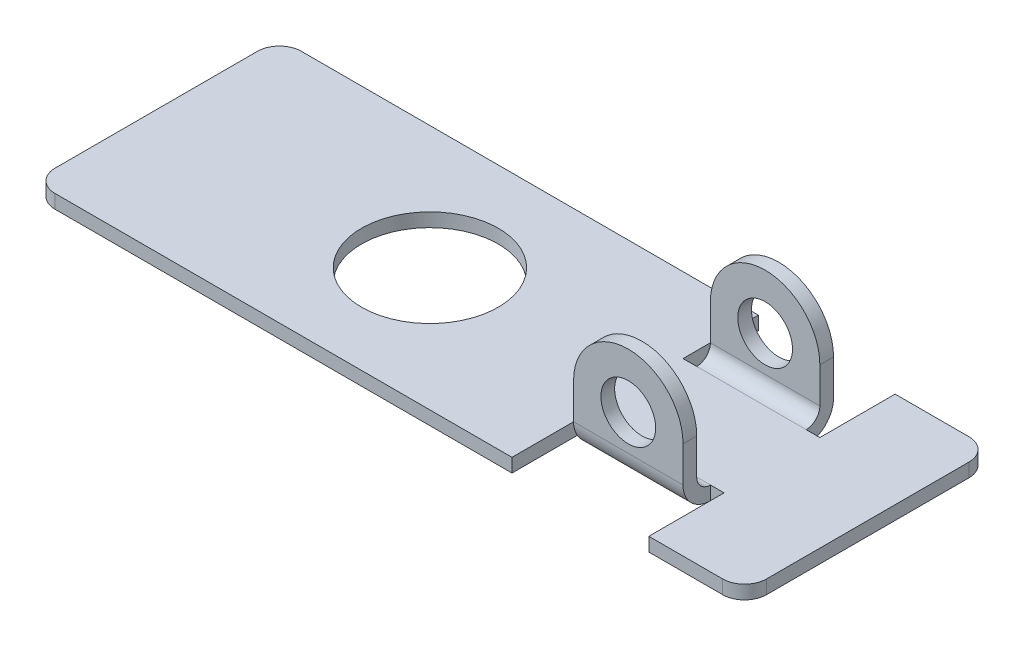
ISO-10303-21;
HEADER;
FILE_DESCRIPTION(('STEP AP214'),'2;1');
FILE_NAME('part.step','',(''),(''),'','','');
FILE_SCHEMA(('AUTOMOTIVE_DESIGN { 1 0 10303 214 1 1 1 1 }'));
ENDSEC;
DATA;
#1=APPLICATION_CONTEXT('core data for automotive mechanical design processes');
#2=APPLICATION_PROTOCOL_DEFINITION('international standard','automotive_design',2000,#1);
#3=PRODUCT_CONTEXT('',#1,'mechanical');
#4=PRODUCT('Part','Part','',(#3));
#5=PRODUCT_RELATED_PRODUCT_CATEGORY('part','',(#4));
#6=PRODUCT_DEFINITION_FORMATION('','',#4);
#7=PRODUCT_DEFINITION_CONTEXT('part definition',#1,'design');
#8=PRODUCT_DEFINITION('design','',#6,#7);
#9=PRODUCT_DEFINITION_SHAPE('','',#8);
#10=(LENGTH_UNIT() NAMED_UNIT(*) SI_UNIT(.MILLI.,.METRE.));
#11=(NAMED_UNIT(*) PLANE_ANGLE_UNIT() SI_UNIT($,.RADIAN.));
#12=(NAMED_UNIT(*) SI_UNIT($,.STERADIAN.) SOLID_ANGLE_UNIT());
#13=UNCERTAINTY_MEASURE_WITH_UNIT(LENGTH_MEASURE(1.E-05),#10,'distance_accuracy_value','');
#14=(GEOMETRIC_REPRESENTATION_CONTEXT(3) GLOBAL_UNCERTAINTY_ASSIGNED_CONTEXT((#13)) GLOBAL_UNIT_ASSIGNED_CONTEXT((#10,
#11,#12)) REPRESENTATION_CONTEXT('',''));
#15=CARTESIAN_POINT('',(0.,0.,0.));
#16=DIRECTION('',(0.,0.,1.));
#17=DIRECTION('',(1.,0.,0.));
#18=AXIS2_PLACEMENT_3D('',#15,#16,#17);
#19=CARTESIAN_POINT('',(0.,0.5,0.));
#20=DIRECTION('',(0.,-1.,0.));
#21=DIRECTION('',(0.,0.,-1.));
#22=AXIS2_PLACEMENT_3D('',#19,#20,#21);
#23=PLANE('',#22);
#24=DIRECTION('',(1.,0.,0.));
#25=VECTOR('',#24,1.);
#26=CARTESIAN_POINT('',(7.5,0.5,1.75));
#27=LINE('',#26,#25);
#28=CARTESIAN_POINT('',(7.5,0.5,1.75));
#29=VERTEX_POINT('',#28);
#30=CARTESIAN_POINT('',(8.,0.5,1.75));
#31=VERTEX_POINT('',#30);
#32=EDGE_CURVE('E308',#29,#31,#27,.T.);
#33=ORIENTED_EDGE('',*,*,#32,.T.);
#34=DIRECTION('',(1.,0.,0.));
#35=VECTOR('',#34,1.);
#36=CARTESIAN_POINT('',(0.,0.5,1.75));
#37=LINE('',#36,#35);
#38=CARTESIAN_POINT('',(12.,0.5,1.75));
#39=VERTEX_POINT('',#38);
#40=EDGE_CURVE('E430',#31,#39,#37,.T.);
#41=ORIENTED_EDGE('',*,*,#40,.T.);
#42=DIRECTION('',(1.,0.,0.));
#43=VECTOR('',#42,1.);
#44=CARTESIAN_POINT('',(12.5,0.5,1.75));
#45=LINE('',#44,#43);
#46=CARTESIAN_POINT('',(12.5,0.5,1.75));
#47=VERTEX_POINT('',#46);
#48=EDGE_CURVE('E311',#39,#47,#45,.T.);
#49=ORIENTED_EDGE('',*,*,#48,.T.);
#50=DIRECTION('',(0.,0.,1.));
#51=VECTOR('',#50,1.);
#52=CARTESIAN_POINT('',(12.5,0.5,4.5));
#53=LINE('',#52,#51);
#54=CARTESIAN_POINT('',(12.5,0.5,4.5));
#55=VERTEX_POINT('',#54);
#56=EDGE_CURVE('E313',#47,#55,#53,.T.);
#57=ORIENTED_EDGE('',*,*,#56,.T.);
#58=DIRECTION('',(1.,0.,0.));
#59=VECTOR('',#58,1.);
#60=CARTESIAN_POINT('',(12.5,0.5,4.5));
#61=LINE('',#60,#59);
#62=CARTESIAN_POINT('',(15.2,0.5,4.5));
#63=VERTEX_POINT('',#62);
#64=EDGE_CURVE('E280',#55,#63,#61,.T.);
#65=ORIENTED_EDGE('',*,*,#64,.T.);
#66=CARTESIAN_POINT('',(15.2,0.5,3.7));
#67=DIRECTION('',(0.,-1.,0.));
#68=DIRECTION('',(0.,0.,-1.));
#69=AXIS2_PLACEMENT_3D('',#66,#67,#68);
#70=CIRCLE('',#69,0.8);
#71=CARTESIAN_POINT('',(16.,0.5,3.7));
#72=VERTEX_POINT('',#71);
#73=EDGE_CURVE('E412',#63,#72,#70,.F.);
#74=ORIENTED_EDGE('',*,*,#73,.T.);
#75=DIRECTION('',(0.,0.,-1.));
#76=VECTOR('',#75,1.);
#77=CARTESIAN_POINT('',(16.,0.5,-4.5));
#78=LINE('',#77,#76);
#79=CARTESIAN_POINT('',(16.,0.5,-3.7));
#80=VERTEX_POINT('',#79);
#81=EDGE_CURVE('E283',#72,#80,#78,.T.);
#82=ORIENTED_EDGE('',*,*,#81,.T.);
#83=CARTESIAN_POINT('',(15.2,0.5,-3.7));
#84=DIRECTION('',(0.,-1.,0.));
#85=DIRECTION('',(0.,0.,-1.));
#86=AXIS2_PLACEMENT_3D('',#83,#84,#85);
#87=CIRCLE('',#86,0.8);
#88=CARTESIAN_POINT('',(15.2,0.5,-4.5));
#89=VERTEX_POINT('',#88);
#90=EDGE_CURVE('E414',#80,#89,#87,.F.);
#91=ORIENTED_EDGE('',*,*,#90,.T.);
#92=DIRECTION('',(-1.,0.,0.));
#93=VECTOR('',#92,1.);
#94=CARTESIAN_POINT('',(12.5,0.5,-4.5));
#95=LINE('',#94,#93);
#96=CARTESIAN_POINT('',(12.5,0.5,-4.5));
#97=VERTEX_POINT('',#96);
#98=EDGE_CURVE('E287',#89,#97,#95,.T.);
#99=ORIENTED_EDGE('',*,*,#98,.T.);
#100=DIRECTION('',(0.,0.,1.));
#101=VECTOR('',#100,1.);
#102=CARTESIAN_POINT('',(12.5,0.5,-1.75));
#103=LINE('',#102,#101);
#104=CARTESIAN_POINT('',(12.5,0.5,-1.75));
#105=VERTEX_POINT('',#104);
#106=EDGE_CURVE('E289',#97,#105,#103,.T.);
#107=ORIENTED_EDGE('',*,*,#106,.T.);
#108=DIRECTION('',(-1.,0.,0.));
#109=VECTOR('',#108,1.);
#110=CARTESIAN_POINT('',(12.5,0.5,-1.75));
#111=LINE('',#110,#109);
#112=CARTESIAN_POINT('',(12.,0.5,-1.75));
#113=VERTEX_POINT('',#112);
#114=EDGE_CURVE('E291',#105,#113,#111,.T.);
#115=ORIENTED_EDGE('',*,*,#114,.T.);
#116=DIRECTION('',(1.,0.,0.));
#117=VECTOR('',#116,1.);
#118=CARTESIAN_POINT('',(0.,0.5,-1.75));
#119=LINE('',#118,#117);
#120=CARTESIAN_POINT('',(8.,0.5,-1.75));
#121=VERTEX_POINT('',#120);
#122=EDGE_CURVE('E428',#113,#121,#119,.F.);
#123=ORIENTED_EDGE('',*,*,#122,.T.);
#124=DIRECTION('',(-1.,0.,0.));
#125=VECTOR('',#124,1.);
#126=CARTESIAN_POINT('',(7.5,0.5,-1.75));
#127=LINE('',#126,#125);
#128=CARTESIAN_POINT('',(7.5,0.5,-1.75));
#129=VERTEX_POINT('',#128);
#130=EDGE_CURVE('E294',#121,#129,#127,.T.);
#131=ORIENTED_EDGE('',*,*,#130,.T.);
#132=DIRECTION('',(0.,0.,-1.));
#133=VECTOR('',#132,1.);
#134=CARTESIAN_POINT('',(7.5,0.5,-4.5));
#135=LINE('',#134,#133);
#136=CARTESIAN_POINT('',(7.5,0.5,-4.5));
#137=VERTEX_POINT('',#136);
#138=EDGE_CURVE('E296',#129,#137,#135,.T.);
#139=ORIENTED_EDGE('',*,*,#138,.T.);
#140=DIRECTION('',(-1.,0.,0.));
#141=VECTOR('',#140,1.);
#142=CARTESIAN_POINT('',(-10.,0.5,-4.5));
#143=LINE('',#142,#141);
#144=CARTESIAN_POINT('',(-9.2,0.5,-4.5));
#145=VERTEX_POINT('',#144);
#146=EDGE_CURVE('E298',#137,#145,#143,.T.);
#147=ORIENTED_EDGE('',*,*,#146,.T.);
#148=CARTESIAN_POINT('',(-9.2,0.5,-3.7));
#149=DIRECTION('',(0.,-1.,0.));
#150=DIRECTION('',(0.,0.,-1.));
#151=AXIS2_PLACEMENT_3D('',#148,#149,#150);
#152=CIRCLE('',#151,0.8);
#153=CARTESIAN_POINT('',(-10.,0.5,-3.7));
#154=VERTEX_POINT('',#153);
#155=EDGE_CURVE('E410',#145,#154,#152,.F.);
#156=ORIENTED_EDGE('',*,*,#155,.T.);
#157=DIRECTION('',(0.,0.,1.));
#158=VECTOR('',#157,1.);
#159=CARTESIAN_POINT('',(-10.,0.5,-4.5));
#160=LINE('',#159,#158);
#161=CARTESIAN_POINT('',(-10.,0.5,3.7));
#162=VERTEX_POINT('',#161);
#163=EDGE_CURVE('E301',#154,#162,#160,.T.);
#164=ORIENTED_EDGE('',*,*,#163,.T.);
#165=CARTESIAN_POINT('',(-9.2,0.5,3.7));
#166=DIRECTION('',(0.,-1.,0.));
#167=DIRECTION('',(0.,0.,-1.));
#168=AXIS2_PLACEMENT_3D('',#165,#166,#167);
#169=CIRCLE('',#168,0.8);
#170=CARTESIAN_POINT('',(-9.2,0.5,4.5));
#171=VERTEX_POINT('',#170);
#172=EDGE_CURVE('E408',#162,#171,#169,.F.);
#173=ORIENTED_EDGE('',*,*,#172,.T.);
#174=DIRECTION('',(1.,0.,0.));
#175=VECTOR('',#174,1.);
#176=CARTESIAN_POINT('',(-10.,0.5,4.5));
#177=LINE('',#176,#175);
#178=CARTESIAN_POINT('',(7.5,0.5,4.5));
#179=VERTEX_POINT('',#178);
#180=EDGE_CURVE('E304',#171,#179,#177,.T.);
#181=ORIENTED_EDGE('',*,*,#180,.T.);
#182=DIRECTION('',(0.,0.,-1.));
#183=VECTOR('',#182,1.);
#184=CARTESIAN_POINT('',(7.5,0.5,1.75));
#185=LINE('',#184,#183);
#186=EDGE_CURVE('E306',#179,#29,#185,.T.);
#187=ORIENTED_EDGE('',*,*,#186,.T.);
#188=EDGE_LOOP('',(#33,#41,#49,#57,#65,#74,#82,#91,#99,#107,#115,#123,#131,#139,#147,#156,#164,
#173,#181,#187));
#189=FACE_BOUND('',#188,.T.);
#190=CARTESIAN_POINT('',(0.,0.5,0.));
#191=DIRECTION('',(0.,1.,0.));
#192=DIRECTION('',(0.,0.,1.));
#193=AXIS2_PLACEMENT_3D('',#190,#191,#192);
#194=CIRCLE('',#193,2.5);
#195=CARTESIAN_POINT('',(0.,0.5,2.5));
#196=VERTEX_POINT('',#195);
#197=EDGE_CURVE('E274',#196,#196,#194,.T.);
#198=ORIENTED_EDGE('',*,*,#197,.F.);
#199=EDGE_LOOP('',(#198));
#200=FACE_BOUND('',#199,.T.);
#201=ADVANCED_FACE('F34',(#189,#200),#23,.F.);
#202=CARTESIAN_POINT('',(0.,0.,0.));
#203=DIRECTION('',(0.,-1.,0.));
#204=DIRECTION('',(0.,0.,-1.));
#205=AXIS2_PLACEMENT_3D('',#202,#203,#204);
#206=PLANE('',#205);
#207=DIRECTION('',(1.,0.,0.));
#208=VECTOR('',#207,1.);
#209=CARTESIAN_POINT('',(12.5,0.,1.75));
#210=LINE('',#209,#208);
#211=CARTESIAN_POINT('',(12.,0.,1.75));
#212=VERTEX_POINT('',#211);
#213=CARTESIAN_POINT('',(12.5,0.,1.75));
#214=VERTEX_POINT('',#213);
#215=EDGE_CURVE('E345',#212,#214,#210,.T.);
#216=ORIENTED_EDGE('',*,*,#215,.F.);
#217=DIRECTION('',(1.,0.,0.));
#218=VECTOR('',#217,1.);
#219=CARTESIAN_POINT('',(8.,0.,1.75));
#220=LINE('',#219,#218);
#221=CARTESIAN_POINT('',(8.,0.,1.75));
#222=VERTEX_POINT('',#221);
#223=EDGE_CURVE('E451',#212,#222,#220,.F.);
#224=ORIENTED_EDGE('',*,*,#223,.T.);
#225=DIRECTION('',(1.,0.,0.));
#226=VECTOR('',#225,1.);
#227=CARTESIAN_POINT('',(7.5,0.,1.75));
#228=LINE('',#227,#226);
#229=CARTESIAN_POINT('',(7.5,0.,1.75));
#230=VERTEX_POINT('',#229);
#231=EDGE_CURVE('E342',#230,#222,#228,.T.);
#232=ORIENTED_EDGE('',*,*,#231,.F.);
#233=DIRECTION('',(0.,0.,-1.));
#234=VECTOR('',#233,1.);
#235=CARTESIAN_POINT('',(7.5,0.,1.75));
#236=LINE('',#235,#234);
#237=CARTESIAN_POINT('',(7.5,0.,4.5));
#238=VERTEX_POINT('',#237);
#239=EDGE_CURVE('E340',#238,#230,#236,.T.);
#240=ORIENTED_EDGE('',*,*,#239,.F.);
#241=DIRECTION('',(1.,0.,0.));
#242=VECTOR('',#241,1.);
#243=CARTESIAN_POINT('',(-10.,0.,4.5));
#244=LINE('',#243,#242);
#245=CARTESIAN_POINT('',(-9.2,0.,4.5));
#246=VERTEX_POINT('',#245);
#247=EDGE_CURVE('E338',#246,#238,#244,.T.);
#248=ORIENTED_EDGE('',*,*,#247,.F.);
#249=CARTESIAN_POINT('',(-9.2,0.,3.7));
#250=DIRECTION('',(0.,-1.,0.));
#251=DIRECTION('',(0.,0.,-1.));
#252=AXIS2_PLACEMENT_3D('',#249,#250,#251);
#253=CIRCLE('',#252,0.8);
#254=CARTESIAN_POINT('',(-10.,0.,3.7));
#255=VERTEX_POINT('',#254);
#256=EDGE_CURVE('E395',#246,#255,#253,.T.);
#257=ORIENTED_EDGE('',*,*,#256,.T.);
#258=DIRECTION('',(0.,0.,1.));
#259=VECTOR('',#258,1.);
#260=CARTESIAN_POINT('',(-10.,0.,-4.5));
#261=LINE('',#260,#259);
#262=CARTESIAN_POINT('',(-10.,0.,-3.7));
#263=VERTEX_POINT('',#262);
#264=EDGE_CURVE('E335',#263,#255,#261,.T.);
#265=ORIENTED_EDGE('',*,*,#264,.F.);
#266=CARTESIAN_POINT('',(-9.2,0.,-3.7));
#267=DIRECTION('',(0.,-1.,0.));
#268=DIRECTION('',(0.,0.,-1.));
#269=AXIS2_PLACEMENT_3D('',#266,#267,#268);
#270=CIRCLE('',#269,0.8);
#271=CARTESIAN_POINT('',(-9.2,0.,-4.5));
#272=VERTEX_POINT('',#271);
#273=EDGE_CURVE('E397',#263,#272,#270,.T.);
#274=ORIENTED_EDGE('',*,*,#273,.T.);
#275=DIRECTION('',(-1.,0.,0.));
#276=VECTOR('',#275,1.);
#277=CARTESIAN_POINT('',(-10.,0.,-4.5));
#278=LINE('',#277,#276);
#279=CARTESIAN_POINT('',(7.5,0.,-4.5));
#280=VERTEX_POINT('',#279);
#281=EDGE_CURVE('E332',#280,#272,#278,.T.);
#282=ORIENTED_EDGE('',*,*,#281,.F.);
#283=DIRECTION('',(0.,0.,-1.));
#284=VECTOR('',#283,1.);
#285=CARTESIAN_POINT('',(7.5,0.,-4.5));
#286=LINE('',#285,#284);
#287=CARTESIAN_POINT('',(7.5,0.,-1.75));
#288=VERTEX_POINT('',#287);
#289=EDGE_CURVE('E330',#288,#280,#286,.T.);
#290=ORIENTED_EDGE('',*,*,#289,.F.);
#291=DIRECTION('',(-1.,0.,0.));
#292=VECTOR('',#291,1.);
#293=CARTESIAN_POINT('',(7.5,0.,-1.75));
#294=LINE('',#293,#292);
#295=CARTESIAN_POINT('',(8.,0.,-1.75));
#296=VERTEX_POINT('',#295);
#297=EDGE_CURVE('E328',#296,#288,#294,.T.);
#298=ORIENTED_EDGE('',*,*,#297,.F.);
#299=DIRECTION('',(-1.,0.,0.));
#300=VECTOR('',#299,1.);
#301=CARTESIAN_POINT('',(12.,0.,-1.75));
#302=LINE('',#301,#300);
#303=CARTESIAN_POINT('',(12.,0.,-1.75));
#304=VERTEX_POINT('',#303);
#305=EDGE_CURVE('E449',#296,#304,#302,.F.);
#306=ORIENTED_EDGE('',*,*,#305,.T.);
#307=DIRECTION('',(-1.,0.,0.));
#308=VECTOR('',#307,1.);
#309=CARTESIAN_POINT('',(12.5,0.,-1.75));
#310=LINE('',#309,#308);
#311=CARTESIAN_POINT('',(12.5,0.,-1.75));
#312=VERTEX_POINT('',#311);
#313=EDGE_CURVE('E325',#312,#304,#310,.T.);
#314=ORIENTED_EDGE('',*,*,#313,.F.);
#315=DIRECTION('',(0.,0.,1.));
#316=VECTOR('',#315,1.);
#317=CARTESIAN_POINT('',(12.5,0.,-1.75));
#318=LINE('',#317,#316);
#319=CARTESIAN_POINT('',(12.5,0.,-4.5));
#320=VERTEX_POINT('',#319);
#321=EDGE_CURVE('E323',#320,#312,#318,.T.);
#322=ORIENTED_EDGE('',*,*,#321,.F.);
#323=DIRECTION('',(-1.,0.,0.));
#324=VECTOR('',#323,1.);
#325=CARTESIAN_POINT('',(12.5,0.,-4.5));
#326=LINE('',#325,#324);
#327=CARTESIAN_POINT('',(15.2,0.,-4.5));
#328=VERTEX_POINT('',#327);
#329=EDGE_CURVE('E321',#328,#320,#326,.T.);
#330=ORIENTED_EDGE('',*,*,#329,.F.);
#331=CARTESIAN_POINT('',(15.2,0.,-3.7));
#332=DIRECTION('',(0.,-1.,0.));
#333=DIRECTION('',(0.,0.,-1.));
#334=AXIS2_PLACEMENT_3D('',#331,#332,#333);
#335=CIRCLE('',#334,0.8);
#336=CARTESIAN_POINT('',(16.,0.,-3.7));
#337=VERTEX_POINT('',#336);
#338=EDGE_CURVE('E401',#328,#337,#335,.T.);
#339=ORIENTED_EDGE('',*,*,#338,.T.);
#340=DIRECTION('',(0.,0.,-1.));
#341=VECTOR('',#340,1.);
#342=CARTESIAN_POINT('',(16.,0.,-4.5));
#343=LINE('',#342,#341);
#344=CARTESIAN_POINT('',(16.,0.,3.7));
#345=VERTEX_POINT('',#344);
#346=EDGE_CURVE('E318',#345,#337,#343,.T.);
#347=ORIENTED_EDGE('',*,*,#346,.F.);
#348=CARTESIAN_POINT('',(15.2,0.,3.7));
#349=DIRECTION('',(0.,-1.,0.));
#350=DIRECTION('',(0.,0.,-1.));
#351=AXIS2_PLACEMENT_3D('',#348,#349,#350);
#352=CIRCLE('',#351,0.8);
#353=CARTESIAN_POINT('',(15.2,0.,4.5));
#354=VERTEX_POINT('',#353);
#355=EDGE_CURVE('E399',#345,#354,#352,.T.);
#356=ORIENTED_EDGE('',*,*,#355,.T.);
#357=DIRECTION('',(1.,0.,0.));
#358=VECTOR('',#357,1.);
#359=CARTESIAN_POINT('',(12.5,0.,4.5));
#360=LINE('',#359,#358);
#361=CARTESIAN_POINT('',(12.5,0.,4.5));
#362=VERTEX_POINT('',#361);
#363=EDGE_CURVE('E277',#362,#354,#360,.T.);
#364=ORIENTED_EDGE('',*,*,#363,.F.);
#365=DIRECTION('',(0.,0.,1.));
#366=VECTOR('',#365,1.);
#367=CARTESIAN_POINT('',(12.5,0.,4.5));
#368=LINE('',#367,#366);
#369=EDGE_CURVE('E284',#214,#362,#368,.T.);
#370=ORIENTED_EDGE('',*,*,#369,.F.);
#371=EDGE_LOOP('',(#216,#224,#232,#240,#248,#257,#265,#274,#282,#290,#298,#306,#314,#322,#330,
#339,#347,#356,#364,#370));
#372=FACE_BOUND('',#371,.T.);
#373=CARTESIAN_POINT('',(0.,0.,0.));
#374=DIRECTION('',(0.,1.,0.));
#375=DIRECTION('',(0.,0.,1.));
#376=AXIS2_PLACEMENT_3D('',#373,#374,#375);
#377=CIRCLE('',#376,2.5);
#378=CARTESIAN_POINT('',(0.,0.,2.5));
#379=VERTEX_POINT('',#378);
#380=EDGE_CURVE('E271',#379,#379,#377,.T.);
#381=ORIENTED_EDGE('',*,*,#380,.T.);
#382=EDGE_LOOP('',(#381));
#383=FACE_BOUND('',#382,.T.);
#384=ADVANCED_FACE('F468',(#372,#383),#206,.T.);
#385=CARTESIAN_POINT('',(12.5,0.5,4.5));
#386=DIRECTION('',(0.,0.,-1.));
#387=DIRECTION('',(-1.,0.,0.));
#388=AXIS2_PLACEMENT_3D('',#385,#386,#387);
#389=PLANE('',#388);
#390=ORIENTED_EDGE('',*,*,#363,.T.);
#391=DIRECTION('',(0.,-1.,0.));
#392=VECTOR('',#391,1.);
#393=CARTESIAN_POINT('',(15.2,0.5,4.5));
#394=LINE('',#393,#392);
#395=EDGE_CURVE('E416',#354,#63,#394,.F.);
#396=ORIENTED_EDGE('',*,*,#395,.T.);
#397=ORIENTED_EDGE('',*,*,#64,.F.);
#398=DIRECTION('',(0.,-1.,0.));
#399=VECTOR('',#398,1.);
#400=CARTESIAN_POINT('',(12.5,0.5,4.5));
#401=LINE('',#400,#399);
#402=EDGE_CURVE('E315',#55,#362,#401,.T.);
#403=ORIENTED_EDGE('',*,*,#402,.T.);
#404=EDGE_LOOP('',(#390,#396,#397,#403));
#405=FACE_BOUND('',#404,.T.);
#406=ADVANCED_FACE('F511',(#405),#389,.F.);
#407=CARTESIAN_POINT('',(16.,0.5,-4.5));
#408=DIRECTION('',(-1.,0.,0.));
#409=DIRECTION('',(0.,0.,1.));
#410=AXIS2_PLACEMENT_3D('',#407,#408,#409);
#411=PLANE('',#410);
#412=ORIENTED_EDGE('',*,*,#346,.T.);
#413=DIRECTION('',(0.,-1.,0.));
#414=VECTOR('',#413,1.);
#415=CARTESIAN_POINT('',(16.,0.5,-3.7));
#416=LINE('',#415,#414);
#417=EDGE_CURVE('E406',#337,#80,#416,.F.);
#418=ORIENTED_EDGE('',*,*,#417,.T.);
#419=ORIENTED_EDGE('',*,*,#81,.F.);
#420=DIRECTION('',(0.,-1.,0.));
#421=VECTOR('',#420,1.);
#422=CARTESIAN_POINT('',(16.,0.5,3.7));
#423=LINE('',#422,#421);
#424=EDGE_CURVE('E403',#72,#345,#423,.T.);
#425=ORIENTED_EDGE('',*,*,#424,.T.);
#426=EDGE_LOOP('',(#412,#418,#419,#425));
#427=FACE_BOUND('',#426,.T.);
#428=ADVANCED_FACE('F501',(#427),#411,.F.);
#429=CARTESIAN_POINT('',(12.5,0.5,-4.5));
#430=DIRECTION('',(0.,0.,1.));
#431=DIRECTION('',(1.,0.,0.));
#432=AXIS2_PLACEMENT_3D('',#429,#430,#431);
#433=PLANE('',#432);
#434=ORIENTED_EDGE('',*,*,#98,.F.);
#435=DIRECTION('',(0.,-1.,0.));
#436=VECTOR('',#435,1.);
#437=CARTESIAN_POINT('',(15.2,0.5,-4.5));
#438=LINE('',#437,#436);
#439=EDGE_CURVE('E392',#89,#328,#438,.T.);
#440=ORIENTED_EDGE('',*,*,#439,.T.);
#441=ORIENTED_EDGE('',*,*,#329,.T.);
#442=DIRECTION('',(0.,-1.,0.));
#443=VECTOR('',#442,1.);
#444=CARTESIAN_POINT('',(12.5,0.5,-4.5));
#445=LINE('',#444,#443);
#446=EDGE_CURVE('E389',#97,#320,#445,.T.);
#447=ORIENTED_EDGE('',*,*,#446,.F.);
#448=EDGE_LOOP('',(#434,#440,#441,#447));
#449=FACE_BOUND('',#448,.T.);
#450=ADVANCED_FACE('F493',(#449),#433,.F.);
#451=CARTESIAN_POINT('',(12.5,0.5,-1.75));
#452=DIRECTION('',(1.,0.,0.));
#453=DIRECTION('',(0.,0.,-1.));
#454=AXIS2_PLACEMENT_3D('',#451,#452,#453);
#455=PLANE('',#454);
#456=ORIENTED_EDGE('',*,*,#321,.T.);
#457=DIRECTION('',(0.,-1.,0.));
#458=VECTOR('',#457,1.);
#459=CARTESIAN_POINT('',(12.5,0.5,-1.75));
#460=LINE('',#459,#458);
#461=EDGE_CURVE('E386',#105,#312,#460,.T.);
#462=ORIENTED_EDGE('',*,*,#461,.F.);
#463=ORIENTED_EDGE('',*,*,#106,.F.);
#464=ORIENTED_EDGE('',*,*,#446,.T.);
#465=EDGE_LOOP('',(#456,#462,#463,#464));
#466=FACE_BOUND('',#465,.T.);
#467=ADVANCED_FACE('F489',(#466),#455,.F.);
#468=CARTESIAN_POINT('',(12.5,0.5,-1.75));
#469=DIRECTION('',(0.,0.,1.));
#470=DIRECTION('',(1.,0.,0.));
#471=AXIS2_PLACEMENT_3D('',#468,#469,#470);
#472=PLANE('',#471);
#473=ORIENTED_EDGE('',*,*,#313,.T.);
#474=DIRECTION('',(0.,-1.,0.));
#475=VECTOR('',#474,1.);
#476=CARTESIAN_POINT('',(12.,0.5,-1.75));
#477=LINE('',#476,#475);
#478=EDGE_CURVE('E384',#113,#304,#477,.T.);
#479=ORIENTED_EDGE('',*,*,#478,.F.);
#480=ORIENTED_EDGE('',*,*,#114,.F.);
#481=ORIENTED_EDGE('',*,*,#461,.T.);
#482=EDGE_LOOP('',(#473,#479,#480,#481));
#483=FACE_BOUND('',#482,.T.);
#484=ADVANCED_FACE('F485',(#483),#472,.F.);
#485=CARTESIAN_POINT('',(12.,0.5,-2.75));
#486=DIRECTION('',(-1.,0.,0.));
#487=DIRECTION('',(0.,0.,1.));
#488=AXIS2_PLACEMENT_3D('',#485,#486,#487);
#489=PLANE('',#488);
#490=ORIENTED_EDGE('',*,*,#478,.T.);
#491=CARTESIAN_POINT('',(12.,1.,-1.75));
#492=DIRECTION('',(-1.,0.,0.));
#493=DIRECTION('',(0.,0.,1.));
#494=AXIS2_PLACEMENT_3D('',#491,#492,#493);
#495=CIRCLE('',#494,1.);
#496=CARTESIAN_POINT('',(12.,1.,-2.75));
#497=VERTEX_POINT('',#496);
#498=EDGE_CURVE('E11',#304,#497,#495,.F.);
#499=ORIENTED_EDGE('',*,*,#498,.T.);
#500=DIRECTION('',(0.,-1.,0.));
#501=VECTOR('',#500,1.);
#502=CARTESIAN_POINT('',(12.,0.5,-2.75));
#503=LINE('',#502,#501);
#504=CARTESIAN_POINT('',(12.,2.3,-2.75));
#505=VERTEX_POINT('',#504);
#506=EDGE_CURVE('E233',#505,#497,#503,.T.);
#507=ORIENTED_EDGE('',*,*,#506,.F.);
#508=DIRECTION('',(0.,0.,-1.));
#509=VECTOR('',#508,1.);
#510=CARTESIAN_POINT('',(12.,2.3,-2.25));
#511=LINE('',#510,#509);
#512=CARTESIAN_POINT('',(12.,2.3,-2.25));
#513=VERTEX_POINT('',#512);
#514=EDGE_CURVE('E231',#513,#505,#511,.T.);
#515=ORIENTED_EDGE('',*,*,#514,.F.);
#516=DIRECTION('',(0.,1.,0.));
#517=VECTOR('',#516,1.);
#518=CARTESIAN_POINT('',(12.,0.5,-2.25));
#519=LINE('',#518,#517);
#520=CARTESIAN_POINT('',(12.,1.,-2.25));
#521=VERTEX_POINT('',#520);
#522=EDGE_CURVE('E218',#521,#513,#519,.T.);
#523=ORIENTED_EDGE('',*,*,#522,.F.);
#524=CARTESIAN_POINT('',(12.,1.,-1.75));
#525=DIRECTION('',(-1.,0.,0.));
#526=DIRECTION('',(0.,0.,1.));
#527=AXIS2_PLACEMENT_3D('',#524,#525,#526);
#528=CIRCLE('',#527,0.5);
#529=EDGE_CURVE('E440',#521,#113,#528,.T.);
#530=ORIENTED_EDGE('',*,*,#529,.T.);
#531=EDGE_LOOP('',(#490,#499,#507,#515,#523,#530));
#532=FACE_BOUND('',#531,.T.);
#533=ADVANCED_FACE('F232',(#532),#489,.F.);
#534=CARTESIAN_POINT('',(8.,0.5,-2.75));
#535=DIRECTION('',(0.,0.,1.));
#536=DIRECTION('',(1.,0.,0.));
#537=AXIS2_PLACEMENT_3D('',#534,#535,#536);
#538=PLANE('',#537);
#539=ORIENTED_EDGE('',*,*,#506,.T.);
#540=DIRECTION('',(-1.,0.,0.));
#541=VECTOR('',#540,1.);
#542=CARTESIAN_POINT('',(8.,1.,-2.75));
#543=LINE('',#542,#541);
#544=CARTESIAN_POINT('',(8.,1.,-2.75));
#545=VERTEX_POINT('',#544);
#546=EDGE_CURVE('E455',#497,#545,#543,.T.);
#547=ORIENTED_EDGE('',*,*,#546,.T.);
#548=DIRECTION('',(0.,-1.,0.));
#549=VECTOR('',#548,1.);
#550=CARTESIAN_POINT('',(8.,0.5,-2.75));
#551=LINE('',#550,#549);
#552=CARTESIAN_POINT('',(7.99999999999999,2.3,-2.75));
#553=VERTEX_POINT('',#552);
#554=EDGE_CURVE('E380',#553,#545,#551,.T.);
#555=ORIENTED_EDGE('',*,*,#554,.F.);
#556=CARTESIAN_POINT('',(9.99999999999999,2.3,-2.75));
#557=DIRECTION('',(0.,0.,1.));
#558=DIRECTION('',(1.,0.,0.));
#559=AXIS2_PLACEMENT_3D('',#556,#557,#558);
#560=CIRCLE('',#559,2.);
#561=EDGE_CURVE('E228',#505,#553,#560,.T.);
#562=ORIENTED_EDGE('',*,*,#561,.F.);
#563=EDGE_LOOP('',(#539,#547,#555,#562));
#564=FACE_BOUND('',#563,.T.);
#565=CARTESIAN_POINT('',(9.99999999999999,2.3,-2.75));
#566=DIRECTION('',(0.,0.,1.));
#567=DIRECTION('',(1.,0.,0.));
#568=AXIS2_PLACEMENT_3D('',#565,#566,#567);
#569=CIRCLE('',#568,0.999999999999998);
#570=CARTESIAN_POINT('',(11.,2.3,-2.75));
#571=VERTEX_POINT('',#570);
#572=EDGE_CURVE('E594',#571,#571,#569,.T.);
#573=ORIENTED_EDGE('',*,*,#572,.T.);
#574=EDGE_LOOP('',(#573));
#575=FACE_BOUND('',#574,.T.);
#576=ADVANCED_FACE('F473',(#564,#575),#538,.F.);
#577=CARTESIAN_POINT('',(8.,0.5,-2.75));
#578=DIRECTION('',(1.,0.,0.));
#579=DIRECTION('',(0.,0.,-1.));
#580=AXIS2_PLACEMENT_3D('',#577,#578,#579);
#581=PLANE('',#580);
#582=ORIENTED_EDGE('',*,*,#554,.T.);
#583=CARTESIAN_POINT('',(8.,1.,-1.75));
#584=DIRECTION('',(1.,0.,0.));
#585=DIRECTION('',(0.,0.,-1.));
#586=AXIS2_PLACEMENT_3D('',#583,#584,#585);
#587=CIRCLE('',#586,1.);
#588=EDGE_CURVE('E42',#545,#296,#587,.F.);
#589=ORIENTED_EDGE('',*,*,#588,.T.);
#590=DIRECTION('',(0.,-1.,0.));
#591=VECTOR('',#590,1.);
#592=CARTESIAN_POINT('',(8.,0.5,-1.75));
#593=LINE('',#592,#591);
#594=EDGE_CURVE('E377',#121,#296,#593,.T.);
#595=ORIENTED_EDGE('',*,*,#594,.F.);
#596=CARTESIAN_POINT('',(8.,1.,-1.75));
#597=DIRECTION('',(1.,0.,0.));
#598=DIRECTION('',(0.,0.,-1.));
#599=AXIS2_PLACEMENT_3D('',#596,#597,#598);
#600=CIRCLE('',#599,0.5);
#601=CARTESIAN_POINT('',(7.99999999999999,1.,-2.25));
#602=VERTEX_POINT('',#601);
#603=EDGE_CURVE('E442',#121,#602,#600,.T.);
#604=ORIENTED_EDGE('',*,*,#603,.T.);
#605=DIRECTION('',(0.,-1.,0.));
#606=VECTOR('',#605,1.);
#607=CARTESIAN_POINT('',(7.99999999999999,0.5,-2.25));
#608=LINE('',#607,#606);
#609=CARTESIAN_POINT('',(7.99999999999999,2.3,-2.25));
#610=VERTEX_POINT('',#609);
#611=EDGE_CURVE('E243',#610,#602,#608,.T.);
#612=ORIENTED_EDGE('',*,*,#611,.F.);
#613=DIRECTION('',(0.,0.,-1.));
#614=VECTOR('',#613,1.);
#615=CARTESIAN_POINT('',(7.99999999999999,2.3,-2.25));
#616=LINE('',#615,#614);
#617=EDGE_CURVE('E238',#610,#553,#616,.T.);
#618=ORIENTED_EDGE('',*,*,#617,.T.);
#619=EDGE_LOOP('',(#582,#589,#595,#604,#612,#618));
#620=FACE_BOUND('',#619,.T.);
#621=ADVANCED_FACE('F458',(#620),#581,.F.);
#622=CARTESIAN_POINT('',(7.5,0.5,-1.75));
#623=DIRECTION('',(0.,0.,1.));
#624=DIRECTION('',(1.,0.,0.));
#625=AXIS2_PLACEMENT_3D('',#622,#623,#624);
#626=PLANE('',#625);
#627=ORIENTED_EDGE('',*,*,#297,.T.);
#628=DIRECTION('',(0.,-1.,0.));
#629=VECTOR('',#628,1.);
#630=CARTESIAN_POINT('',(7.5,0.5,-1.75));
#631=LINE('',#630,#629);
#632=EDGE_CURVE('E374',#129,#288,#631,.T.);
#633=ORIENTED_EDGE('',*,*,#632,.F.);
#634=ORIENTED_EDGE('',*,*,#130,.F.);
#635=ORIENTED_EDGE('',*,*,#594,.T.);
#636=EDGE_LOOP('',(#627,#633,#634,#635));
#637=FACE_BOUND('',#636,.T.);
#638=ADVANCED_FACE('F462',(#637),#626,.F.);
#639=CARTESIAN_POINT('',(7.5,0.5,-4.5));
#640=DIRECTION('',(-1.,0.,0.));
#641=DIRECTION('',(0.,0.,1.));
#642=AXIS2_PLACEMENT_3D('',#639,#640,#641);
#643=PLANE('',#642);
#644=ORIENTED_EDGE('',*,*,#289,.T.);
#645=DIRECTION('',(0.,-1.,0.));
#646=VECTOR('',#645,1.);
#647=CARTESIAN_POINT('',(7.5,0.5,-4.5));
#648=LINE('',#647,#646);
#649=EDGE_CURVE('E371',#137,#280,#648,.T.);
#650=ORIENTED_EDGE('',*,*,#649,.F.);
#651=ORIENTED_EDGE('',*,*,#138,.F.);
#652=ORIENTED_EDGE('',*,*,#632,.T.);
#653=EDGE_LOOP('',(#644,#650,#651,#652));
#654=FACE_BOUND('',#653,.T.);
#655=ADVANCED_FACE('F694',(#654),#643,.F.);
#656=CARTESIAN_POINT('',(-10.,0.5,-4.5));
#657=DIRECTION('',(0.,0.,1.));
#658=DIRECTION('',(1.,0.,0.));
#659=AXIS2_PLACEMENT_3D('',#656,#657,#658);
#660=PLANE('',#659);
#661=ORIENTED_EDGE('',*,*,#281,.T.);
#662=DIRECTION('',(0.,-1.,0.));
#663=VECTOR('',#662,1.);
#664=CARTESIAN_POINT('',(-9.2,0.5,-4.5));
#665=LINE('',#664,#663);
#666=EDGE_CURVE('E423',#272,#145,#665,.F.);
#667=ORIENTED_EDGE('',*,*,#666,.T.);
#668=ORIENTED_EDGE('',*,*,#146,.F.);
#669=ORIENTED_EDGE('',*,*,#649,.T.);
#670=EDGE_LOOP('',(#661,#667,#668,#669));
#671=FACE_BOUND('',#670,.T.);
#672=ADVANCED_FACE('F802',(#671),#660,.F.);
#673=CARTESIAN_POINT('',(-10.,0.5,-4.5));
#674=DIRECTION('',(1.,0.,0.));
#675=DIRECTION('',(0.,0.,-1.));
#676=AXIS2_PLACEMENT_3D('',#673,#674,#675);
#677=PLANE('',#676);
#678=ORIENTED_EDGE('',*,*,#163,.F.);
#679=DIRECTION('',(0.,-1.,0.));
#680=VECTOR('',#679,1.);
#681=CARTESIAN_POINT('',(-10.,0.5,-3.7));
#682=LINE('',#681,#680);
#683=EDGE_CURVE('E420',#154,#263,#682,.T.);
#684=ORIENTED_EDGE('',*,*,#683,.T.);
#685=ORIENTED_EDGE('',*,*,#264,.T.);
#686=DIRECTION('',(0.,-1.,0.));
#687=VECTOR('',#686,1.);
#688=CARTESIAN_POINT('',(-10.,0.5,3.7));
#689=LINE('',#688,#687);
#690=EDGE_CURVE('E418',#255,#162,#689,.F.);
#691=ORIENTED_EDGE('',*,*,#690,.T.);
#692=EDGE_LOOP('',(#678,#684,#685,#691));
#693=FACE_BOUND('',#692,.T.);
#694=ADVANCED_FACE('F792',(#693),#677,.F.);
#695=CARTESIAN_POINT('',(-10.,0.5,4.5));
#696=DIRECTION('',(0.,0.,-1.));
#697=DIRECTION('',(-1.,0.,0.));
#698=AXIS2_PLACEMENT_3D('',#695,#696,#697);
#699=PLANE('',#698);
#700=ORIENTED_EDGE('',*,*,#180,.F.);
#701=DIRECTION('',(0.,-1.,0.));
#702=VECTOR('',#701,1.);
#703=CARTESIAN_POINT('',(-9.2,0.5,4.5));
#704=LINE('',#703,#702);
#705=EDGE_CURVE('E425',#171,#246,#704,.T.);
#706=ORIENTED_EDGE('',*,*,#705,.T.);
#707=ORIENTED_EDGE('',*,*,#247,.T.);
#708=DIRECTION('',(0.,-1.,0.));
#709=VECTOR('',#708,1.);
#710=CARTESIAN_POINT('',(7.5,0.5,4.5));
#711=LINE('',#710,#709);
#712=EDGE_CURVE('E368',#179,#238,#711,.T.);
#713=ORIENTED_EDGE('',*,*,#712,.F.);
#714=EDGE_LOOP('',(#700,#706,#707,#713));
#715=FACE_BOUND('',#714,.T.);
#716=ADVANCED_FACE('F787',(#715),#699,.F.);
#717=CARTESIAN_POINT('',(7.5,0.5,1.75));
#718=DIRECTION('',(-1.,0.,0.));
#719=DIRECTION('',(0.,0.,1.));
#720=AXIS2_PLACEMENT_3D('',#717,#718,#719);
#721=PLANE('',#720);
#722=ORIENTED_EDGE('',*,*,#239,.T.);
#723=DIRECTION('',(0.,-1.,0.));
#724=VECTOR('',#723,1.);
#725=CARTESIAN_POINT('',(7.5,0.5,1.75));
#726=LINE('',#725,#724);
#727=EDGE_CURVE('E365',#29,#230,#726,.T.);
#728=ORIENTED_EDGE('',*,*,#727,.F.);
#729=ORIENTED_EDGE('',*,*,#186,.F.);
#730=ORIENTED_EDGE('',*,*,#712,.T.);
#731=EDGE_LOOP('',(#722,#728,#729,#730));
#732=FACE_BOUND('',#731,.T.);
#733=ADVANCED_FACE('F682',(#732),#721,.F.);
#734=CARTESIAN_POINT('',(7.5,0.5,1.75));
#735=DIRECTION('',(0.,0.,-1.));
#736=DIRECTION('',(-1.,0.,0.));
#737=AXIS2_PLACEMENT_3D('',#734,#735,#736);
#738=PLANE('',#737);
#739=ORIENTED_EDGE('',*,*,#231,.T.);
#740=DIRECTION('',(0.,-1.,0.));
#741=VECTOR('',#740,1.);
#742=CARTESIAN_POINT('',(8.,0.5,1.75));
#743=LINE('',#742,#741);
#744=EDGE_CURVE('E362',#31,#222,#743,.T.);
#745=ORIENTED_EDGE('',*,*,#744,.F.);
#746=ORIENTED_EDGE('',*,*,#32,.F.);
#747=ORIENTED_EDGE('',*,*,#727,.T.);
#748=EDGE_LOOP('',(#739,#745,#746,#747));
#749=FACE_BOUND('',#748,.T.);
#750=ADVANCED_FACE('F671',(#749),#738,.F.);
#751=CARTESIAN_POINT('',(8.,0.5,2.75));
#752=DIRECTION('',(1.,0.,0.));
#753=DIRECTION('',(0.,0.,-1.));
#754=AXIS2_PLACEMENT_3D('',#751,#752,#753);
#755=PLANE('',#754);
#756=ORIENTED_EDGE('',*,*,#744,.T.);
#757=CARTESIAN_POINT('',(8.,1.,1.75));
#758=DIRECTION('',(1.,0.,0.));
#759=DIRECTION('',(0.,0.,-1.));
#760=AXIS2_PLACEMENT_3D('',#757,#758,#759);
#761=CIRCLE('',#760,1.);
#762=CARTESIAN_POINT('',(8.,1.,2.75));
#763=VERTEX_POINT('',#762);
#764=EDGE_CURVE('E453',#222,#763,#761,.F.);
#765=ORIENTED_EDGE('',*,*,#764,.T.);
#766=DIRECTION('',(0.,-1.,0.));
#767=VECTOR('',#766,1.);
#768=CARTESIAN_POINT('',(8.,0.5,2.75));
#769=LINE('',#768,#767);
#770=CARTESIAN_POINT('',(7.99999999999999,2.3,2.75));
#771=VERTEX_POINT('',#770);
#772=EDGE_CURVE('E359',#771,#763,#769,.T.);
#773=ORIENTED_EDGE('',*,*,#772,.F.);
#774=DIRECTION('',(0.,0.,1.));
#775=VECTOR('',#774,1.);
#776=CARTESIAN_POINT('',(7.99999999999999,2.3,2.25));
#777=LINE('',#776,#775);
#778=CARTESIAN_POINT('',(7.99999999999999,2.3,2.25));
#779=VERTEX_POINT('',#778);
#780=EDGE_CURVE('E268',#779,#771,#777,.T.);
#781=ORIENTED_EDGE('',*,*,#780,.F.);
#782=DIRECTION('',(0.,-1.,0.));
#783=VECTOR('',#782,1.);
#784=CARTESIAN_POINT('',(7.99999999999999,0.5,2.25));
#785=LINE('',#784,#783);
#786=CARTESIAN_POINT('',(7.99999999999999,1.,2.25));
#787=VERTEX_POINT('',#786);
#788=EDGE_CURVE('E257',#779,#787,#785,.T.);
#789=ORIENTED_EDGE('',*,*,#788,.T.);
#790=CARTESIAN_POINT('',(8.,1.,1.75));
#791=DIRECTION('',(1.,0.,0.));
#792=DIRECTION('',(0.,0.,-1.));
#793=AXIS2_PLACEMENT_3D('',#790,#791,#792);
#794=CIRCLE('',#793,0.5);
#795=EDGE_CURVE('E438',#787,#31,#794,.T.);
#796=ORIENTED_EDGE('',*,*,#795,.T.);
#797=EDGE_LOOP('',(#756,#765,#773,#781,#789,#796));
#798=FACE_BOUND('',#797,.T.);
#799=ADVANCED_FACE('F526',(#798),#755,.F.);
#800=CARTESIAN_POINT('',(12.,0.5,2.75));
#801=DIRECTION('',(0.,0.,-1.));
#802=DIRECTION('',(-1.,0.,0.));
#803=AXIS2_PLACEMENT_3D('',#800,#801,#802);
#804=PLANE('',#803);
#805=ORIENTED_EDGE('',*,*,#772,.T.);
#806=DIRECTION('',(1.,0.,0.));
#807=VECTOR('',#806,1.);
#808=CARTESIAN_POINT('',(12.,1.,2.75));
#809=LINE('',#808,#807);
#810=CARTESIAN_POINT('',(12.,1.,2.75));
#811=VERTEX_POINT('',#810);
#812=EDGE_CURVE('E444',#763,#811,#809,.T.);
#813=ORIENTED_EDGE('',*,*,#812,.T.);
#814=DIRECTION('',(0.,-1.,0.));
#815=VECTOR('',#814,1.);
#816=CARTESIAN_POINT('',(12.,0.5,2.75));
#817=LINE('',#816,#815);
#818=CARTESIAN_POINT('',(12.,2.3,2.75));
#819=VERTEX_POINT('',#818);
#820=EDGE_CURVE('E356',#819,#811,#817,.T.);
#821=ORIENTED_EDGE('',*,*,#820,.F.);
#822=CARTESIAN_POINT('',(9.99999999999999,2.3,2.75));
#823=DIRECTION('',(0.,0.,-1.));
#824=DIRECTION('',(-1.,0.,0.));
#825=AXIS2_PLACEMENT_3D('',#822,#823,#824);
#826=CIRCLE('',#825,2.);
#827=EDGE_CURVE('E254',#771,#819,#826,.T.);
#828=ORIENTED_EDGE('',*,*,#827,.F.);
#829=EDGE_LOOP('',(#805,#813,#821,#828));
#830=FACE_BOUND('',#829,.T.);
#831=CARTESIAN_POINT('',(9.99999999999999,2.3,2.75));
#832=DIRECTION('',(0.,0.,-1.));
#833=DIRECTION('',(-1.,0.,0.));
#834=AXIS2_PLACEMENT_3D('',#831,#832,#833);
#835=CIRCLE('',#834,0.999999999999998);
#836=CARTESIAN_POINT('',(9.,2.3,2.75));
#837=VERTEX_POINT('',#836);
#838=EDGE_CURVE('E237',#837,#837,#835,.T.);
#839=ORIENTED_EDGE('',*,*,#838,.T.);
#840=EDGE_LOOP('',(#839));
#841=FACE_BOUND('',#840,.T.);
#842=ADVANCED_FACE('F530',(#830,#841),#804,.F.);
#843=CARTESIAN_POINT('',(12.,0.5,2.75));
#844=DIRECTION('',(-1.,0.,0.));
#845=DIRECTION('',(0.,0.,1.));
#846=AXIS2_PLACEMENT_3D('',#843,#844,#845);
#847=PLANE('',#846);
#848=ORIENTED_EDGE('',*,*,#820,.T.);
#849=CARTESIAN_POINT('',(12.,1.,1.75));
#850=DIRECTION('',(-1.,0.,0.));
#851=DIRECTION('',(0.,0.,1.));
#852=AXIS2_PLACEMENT_3D('',#849,#850,#851);
#853=CIRCLE('',#852,1.);
#854=EDGE_CURVE('E447',#811,#212,#853,.F.);
#855=ORIENTED_EDGE('',*,*,#854,.T.);
#856=DIRECTION('',(0.,-1.,0.));
#857=VECTOR('',#856,1.);
#858=CARTESIAN_POINT('',(12.,0.5,1.75));
#859=LINE('',#858,#857);
#860=EDGE_CURVE('E353',#39,#212,#859,.T.);
#861=ORIENTED_EDGE('',*,*,#860,.F.);
#862=CARTESIAN_POINT('',(12.,1.,1.75));
#863=DIRECTION('',(-1.,0.,0.));
#864=DIRECTION('',(0.,0.,1.));
#865=AXIS2_PLACEMENT_3D('',#862,#863,#864);
#866=CIRCLE('',#865,0.5);
#867=CARTESIAN_POINT('',(12.,1.,2.25));
#868=VERTEX_POINT('',#867);
#869=EDGE_CURVE('E436',#39,#868,#866,.T.);
#870=ORIENTED_EDGE('',*,*,#869,.T.);
#871=DIRECTION('',(0.,1.,0.));
#872=VECTOR('',#871,1.);
#873=CARTESIAN_POINT('',(12.,0.5,2.25));
#874=LINE('',#873,#872);
#875=CARTESIAN_POINT('',(12.,2.3,2.25));
#876=VERTEX_POINT('',#875);
#877=EDGE_CURVE('E260',#868,#876,#874,.T.);
#878=ORIENTED_EDGE('',*,*,#877,.T.);
#879=DIRECTION('',(0.,0.,1.));
#880=VECTOR('',#879,1.);
#881=CARTESIAN_POINT('',(12.,2.3,2.25));
#882=LINE('',#881,#880);
#883=EDGE_CURVE('E265',#876,#819,#882,.T.);
#884=ORIENTED_EDGE('',*,*,#883,.T.);
#885=EDGE_LOOP('',(#848,#855,#861,#870,#878,#884));
#886=FACE_BOUND('',#885,.T.);
#887=ADVANCED_FACE('F547',(#886),#847,.F.);
#888=CARTESIAN_POINT('',(12.5,0.5,1.75));
#889=DIRECTION('',(0.,0.,-1.));
#890=DIRECTION('',(-1.,0.,0.));
#891=AXIS2_PLACEMENT_3D('',#888,#889,#890);
#892=PLANE('',#891);
#893=ORIENTED_EDGE('',*,*,#215,.T.);
#894=DIRECTION('',(0.,-1.,0.));
#895=VECTOR('',#894,1.);
#896=CARTESIAN_POINT('',(12.5,0.5,1.75));
#897=LINE('',#896,#895);
#898=EDGE_CURVE('E350',#47,#214,#897,.T.);
#899=ORIENTED_EDGE('',*,*,#898,.F.);
#900=ORIENTED_EDGE('',*,*,#48,.F.);
#901=ORIENTED_EDGE('',*,*,#860,.T.);
#902=EDGE_LOOP('',(#893,#899,#900,#901));
#903=FACE_BOUND('',#902,.T.);
#904=ADVANCED_FACE('F549',(#903),#892,.F.);
#905=CARTESIAN_POINT('',(12.5,0.5,4.5));
#906=DIRECTION('',(1.,0.,0.));
#907=DIRECTION('',(0.,0.,-1.));
#908=AXIS2_PLACEMENT_3D('',#905,#906,#907);
#909=PLANE('',#908);
#910=ORIENTED_EDGE('',*,*,#369,.T.);
#911=ORIENTED_EDGE('',*,*,#402,.F.);
#912=ORIENTED_EDGE('',*,*,#56,.F.);
#913=ORIENTED_EDGE('',*,*,#898,.T.);
#914=EDGE_LOOP('',(#910,#911,#912,#913));
#915=FACE_BOUND('',#914,.T.);
#916=ADVANCED_FACE('F516',(#915),#909,.F.);
#917=CARTESIAN_POINT('',(0.,0.5,0.));
#918=DIRECTION('',(0.,-1.,0.));
#919=DIRECTION('',(0.,0.,-1.));
#920=AXIS2_PLACEMENT_3D('',#917,#918,#919);
#921=CYLINDRICAL_SURFACE('',#920,2.5);
#922=ORIENTED_EDGE('',*,*,#197,.T.);
#923=EDGE_LOOP('',(#922));
#924=FACE_BOUND('',#923,.T.);
#925=ORIENTED_EDGE('',*,*,#380,.F.);
#926=EDGE_LOOP('',(#925));
#927=FACE_BOUND('',#926,.T.);
#928=ADVANCED_FACE('F556',(#924,#927),#921,.F.);
#929=CARTESIAN_POINT('',(9.99999999999999,2.3,2.25));
#930=DIRECTION('',(0.,0.,-1.));
#931=DIRECTION('',(-1.,0.,0.));
#932=AXIS2_PLACEMENT_3D('',#929,#930,#931);
#933=PLANE('',#932);
#934=ORIENTED_EDGE('',*,*,#877,.F.);
#935=DIRECTION('',(1.,0.,0.));
#936=VECTOR('',#935,1.);
#937=CARTESIAN_POINT('',(9.99999999999999,1.,2.25));
#938=LINE('',#937,#936);
#939=EDGE_CURVE('E433',#868,#787,#938,.F.);
#940=ORIENTED_EDGE('',*,*,#939,.T.);
#941=ORIENTED_EDGE('',*,*,#788,.F.);
#942=CARTESIAN_POINT('',(9.99999999999999,2.3,2.25));
#943=DIRECTION('',(0.,0.,-1.));
#944=DIRECTION('',(-1.,0.,0.));
#945=AXIS2_PLACEMENT_3D('',#942,#943,#944);
#946=CIRCLE('',#945,2.);
#947=EDGE_CURVE('E262',#779,#876,#946,.T.);
#948=ORIENTED_EDGE('',*,*,#947,.T.);
#949=EDGE_LOOP('',(#934,#940,#941,#948));
#950=FACE_BOUND('',#949,.T.);
#951=CARTESIAN_POINT('',(9.99999999999999,2.3,2.25));
#952=DIRECTION('',(0.,0.,-1.));
#953=DIRECTION('',(-1.,0.,0.));
#954=AXIS2_PLACEMENT_3D('',#951,#952,#953);
#955=CIRCLE('',#954,0.999999999999998);
#956=CARTESIAN_POINT('',(9.,2.3,2.25));
#957=VERTEX_POINT('',#956);
#958=EDGE_CURVE('E251',#957,#957,#955,.T.);
#959=ORIENTED_EDGE('',*,*,#958,.F.);
#960=EDGE_LOOP('',(#959));
#961=FACE_BOUND('',#960,.T.);
#962=ADVANCED_FACE('F568',(#950,#961),#933,.T.);
#963=CARTESIAN_POINT('',(9.99999999999999,2.3,2.25));
#964=DIRECTION('',(0.,0.,1.));
#965=DIRECTION('',(1.,0.,0.));
#966=AXIS2_PLACEMENT_3D('',#963,#964,#965);
#967=CYLINDRICAL_SURFACE('',#966,2.);
#968=ORIENTED_EDGE('',*,*,#827,.T.);
#969=ORIENTED_EDGE('',*,*,#883,.F.);
#970=ORIENTED_EDGE('',*,*,#947,.F.);
#971=ORIENTED_EDGE('',*,*,#780,.T.);
#972=EDGE_LOOP('',(#968,#969,#970,#971));
#973=FACE_BOUND('',#972,.T.);
#974=ADVANCED_FACE('F534',(#973),#967,.T.);
#975=CARTESIAN_POINT('',(9.99999999999999,2.3,2.25));
#976=DIRECTION('',(0.,0.,1.));
#977=DIRECTION('',(1.,0.,0.));
#978=AXIS2_PLACEMENT_3D('',#975,#976,#977);
#979=CYLINDRICAL_SURFACE('',#978,0.999999999999998);
#980=ORIENTED_EDGE('',*,*,#958,.T.);
#981=EDGE_LOOP('',(#980));
#982=FACE_BOUND('',#981,.T.);
#983=ORIENTED_EDGE('',*,*,#838,.F.);
#984=EDGE_LOOP('',(#983));
#985=FACE_BOUND('',#984,.T.);
#986=ADVANCED_FACE('F572',(#982,#985),#979,.F.);
#987=CARTESIAN_POINT('',(9.99999999999999,2.3,-2.25));
#988=DIRECTION('',(0.,0.,1.));
#989=DIRECTION('',(1.,0.,0.));
#990=AXIS2_PLACEMENT_3D('',#987,#988,#989);
#991=PLANE('',#990);
#992=ORIENTED_EDGE('',*,*,#611,.T.);
#993=DIRECTION('',(1.,0.,0.));
#994=VECTOR('',#993,1.);
#995=CARTESIAN_POINT('',(9.99999999999999,1.,-2.25));
#996=LINE('',#995,#994);
#997=EDGE_CURVE('E227',#602,#521,#996,.T.);
#998=ORIENTED_EDGE('',*,*,#997,.T.);
#999=ORIENTED_EDGE('',*,*,#522,.T.);
#1000=CARTESIAN_POINT('',(9.99999999999999,2.3,-2.25));
#1001=DIRECTION('',(0.,0.,1.));
#1002=DIRECTION('',(1.,0.,0.));
#1003=AXIS2_PLACEMENT_3D('',#1000,#1001,#1002);
#1004=CIRCLE('',#1003,2.);
#1005=EDGE_CURVE('E224',#513,#610,#1004,.T.);
#1006=ORIENTED_EDGE('',*,*,#1005,.T.);
#1007=EDGE_LOOP('',(#992,#998,#999,#1006));
#1008=FACE_BOUND('',#1007,.T.);
#1009=CARTESIAN_POINT('',(9.99999999999999,2.3,-2.25));
#1010=DIRECTION('',(0.,0.,1.));
#1011=DIRECTION('',(1.,0.,0.));
#1012=AXIS2_PLACEMENT_3D('',#1009,#1010,#1011);
#1013=CIRCLE('',#1012,0.999999999999998);
#1014=CARTESIAN_POINT('',(11.,2.3,-2.25));
#1015=VERTEX_POINT('',#1014);
#1016=EDGE_CURVE('E249',#1015,#1015,#1013,.T.);
#1017=ORIENTED_EDGE('',*,*,#1016,.F.);
#1018=EDGE_LOOP('',(#1017));
#1019=FACE_BOUND('',#1018,.T.);
#1020=ADVANCED_FACE('F221',(#1008,#1019),#991,.T.);
#1021=CARTESIAN_POINT('',(9.99999999999999,2.3,-2.25));
#1022=DIRECTION('',(0.,0.,-1.));
#1023=DIRECTION('',(-1.,0.,0.));
#1024=AXIS2_PLACEMENT_3D('',#1021,#1022,#1023);
#1025=CYLINDRICAL_SURFACE('',#1024,2.);
#1026=ORIENTED_EDGE('',*,*,#561,.T.);
#1027=ORIENTED_EDGE('',*,*,#617,.F.);
#1028=ORIENTED_EDGE('',*,*,#1005,.F.);
#1029=ORIENTED_EDGE('',*,*,#514,.T.);
#1030=EDGE_LOOP('',(#1026,#1027,#1028,#1029));
#1031=FACE_BOUND('',#1030,.T.);
#1032=ADVANCED_FACE('F240',(#1031),#1025,.T.);
#1033=CARTESIAN_POINT('',(9.99999999999999,2.3,-2.25));
#1034=DIRECTION('',(0.,0.,-1.));
#1035=DIRECTION('',(-1.,0.,0.));
#1036=AXIS2_PLACEMENT_3D('',#1033,#1034,#1035);
#1037=CYLINDRICAL_SURFACE('',#1036,0.999999999999998);
#1038=ORIENTED_EDGE('',*,*,#1016,.T.);
#1039=EDGE_LOOP('',(#1038));
#1040=FACE_BOUND('',#1039,.T.);
#1041=ORIENTED_EDGE('',*,*,#572,.F.);
#1042=EDGE_LOOP('',(#1041));
#1043=FACE_BOUND('',#1042,.T.);
#1044=ADVANCED_FACE('F580',(#1040,#1043),#1037,.F.);
#1045=CARTESIAN_POINT('',(15.2,0.5,-3.7));
#1046=DIRECTION('',(0.,-1.,0.));
#1047=DIRECTION('',(0.,0.,-1.));
#1048=AXIS2_PLACEMENT_3D('',#1045,#1046,#1047);
#1049=CYLINDRICAL_SURFACE('',#1048,0.8);
#1050=ORIENTED_EDGE('',*,*,#90,.F.);
#1051=ORIENTED_EDGE('',*,*,#417,.F.);
#1052=ORIENTED_EDGE('',*,*,#338,.F.);
#1053=ORIENTED_EDGE('',*,*,#439,.F.);
#1054=EDGE_LOOP('',(#1050,#1051,#1052,#1053));
#1055=FACE_BOUND('',#1054,.T.);
#1056=ADVANCED_FACE('F497',(#1055),#1049,.T.);
#1057=CARTESIAN_POINT('',(15.2,0.5,3.7));
#1058=DIRECTION('',(0.,-1.,0.));
#1059=DIRECTION('',(0.,0.,-1.));
#1060=AXIS2_PLACEMENT_3D('',#1057,#1058,#1059);
#1061=CYLINDRICAL_SURFACE('',#1060,0.8);
#1062=ORIENTED_EDGE('',*,*,#73,.F.);
#1063=ORIENTED_EDGE('',*,*,#395,.F.);
#1064=ORIENTED_EDGE('',*,*,#355,.F.);
#1065=ORIENTED_EDGE('',*,*,#424,.F.);
#1066=EDGE_LOOP('',(#1062,#1063,#1064,#1065));
#1067=FACE_BOUND('',#1066,.T.);
#1068=ADVANCED_FACE('F506',(#1067),#1061,.T.);
#1069=CARTESIAN_POINT('',(-9.2,0.5,-3.7));
#1070=DIRECTION('',(0.,-1.,0.));
#1071=DIRECTION('',(0.,0.,-1.));
#1072=AXIS2_PLACEMENT_3D('',#1069,#1070,#1071);
#1073=CYLINDRICAL_SURFACE('',#1072,0.8);
#1074=ORIENTED_EDGE('',*,*,#155,.F.);
#1075=ORIENTED_EDGE('',*,*,#666,.F.);
#1076=ORIENTED_EDGE('',*,*,#273,.F.);
#1077=ORIENTED_EDGE('',*,*,#683,.F.);
#1078=EDGE_LOOP('',(#1074,#1075,#1076,#1077));
#1079=FACE_BOUND('',#1078,.T.);
#1080=ADVANCED_FACE('F618',(#1079),#1073,.T.);
#1081=CARTESIAN_POINT('',(-9.2,0.5,3.7));
#1082=DIRECTION('',(0.,-1.,0.));
#1083=DIRECTION('',(0.,0.,-1.));
#1084=AXIS2_PLACEMENT_3D('',#1081,#1082,#1083);
#1085=CYLINDRICAL_SURFACE('',#1084,0.8);
#1086=ORIENTED_EDGE('',*,*,#172,.F.);
#1087=ORIENTED_EDGE('',*,*,#690,.F.);
#1088=ORIENTED_EDGE('',*,*,#256,.F.);
#1089=ORIENTED_EDGE('',*,*,#705,.F.);
#1090=EDGE_LOOP('',(#1086,#1087,#1088,#1089));
#1091=FACE_BOUND('',#1090,.T.);
#1092=ADVANCED_FACE('F621',(#1091),#1085,.T.);
#1093=CARTESIAN_POINT('',(0.,1.,1.75));
#1094=DIRECTION('',(1.,0.,0.));
#1095=DIRECTION('',(0.,0.,-1.));
#1096=AXIS2_PLACEMENT_3D('',#1093,#1094,#1095);
#1097=CYLINDRICAL_SURFACE('',#1096,0.5);
#1098=ORIENTED_EDGE('',*,*,#795,.F.);
#1099=ORIENTED_EDGE('',*,*,#939,.F.);
#1100=ORIENTED_EDGE('',*,*,#869,.F.);
#1101=ORIENTED_EDGE('',*,*,#40,.F.);
#1102=EDGE_LOOP('',(#1098,#1099,#1100,#1101));
#1103=FACE_BOUND('',#1102,.T.);
#1104=ADVANCED_FACE('F542',(#1103),#1097,.F.);
#1105=CARTESIAN_POINT('',(9.99999999999999,1.,-1.75));
#1106=DIRECTION('',(1.,0.,0.));
#1107=DIRECTION('',(0.,0.,-1.));
#1108=AXIS2_PLACEMENT_3D('',#1105,#1106,#1107);
#1109=CYLINDRICAL_SURFACE('',#1108,0.5);
#1110=ORIENTED_EDGE('',*,*,#603,.F.);
#1111=ORIENTED_EDGE('',*,*,#122,.F.);
#1112=ORIENTED_EDGE('',*,*,#529,.F.);
#1113=ORIENTED_EDGE('',*,*,#997,.F.);
#1114=EDGE_LOOP('',(#1110,#1111,#1112,#1113));
#1115=FACE_BOUND('',#1114,.T.);
#1116=ADVANCED_FACE('F476',(#1115),#1109,.F.);
#1117=CARTESIAN_POINT('',(12.,1.,1.75));
#1118=DIRECTION('',(-1.,0.,0.));
#1119=DIRECTION('',(0.,0.,1.));
#1120=AXIS2_PLACEMENT_3D('',#1117,#1118,#1119);
#1121=CYLINDRICAL_SURFACE('',#1120,1.);
#1122=ORIENTED_EDGE('',*,*,#764,.F.);
#1123=ORIENTED_EDGE('',*,*,#223,.F.);
#1124=ORIENTED_EDGE('',*,*,#854,.F.);
#1125=ORIENTED_EDGE('',*,*,#812,.F.);
#1126=EDGE_LOOP('',(#1122,#1123,#1124,#1125));
#1127=FACE_BOUND('',#1126,.T.);
#1128=ADVANCED_FACE('F523',(#1127),#1121,.T.);
#1129=CARTESIAN_POINT('',(8.,1.,-1.75));
#1130=DIRECTION('',(1.,0.,0.));
#1131=DIRECTION('',(0.,0.,-1.));
#1132=AXIS2_PLACEMENT_3D('',#1129,#1130,#1131);
#1133=CYLINDRICAL_SURFACE('',#1132,1.);
#1134=ORIENTED_EDGE('',*,*,#498,.F.);
#1135=ORIENTED_EDGE('',*,*,#305,.F.);
#1136=ORIENTED_EDGE('',*,*,#588,.F.);
#1137=ORIENTED_EDGE('',*,*,#546,.F.);
#1138=EDGE_LOOP('',(#1134,#1135,#1136,#1137));
#1139=FACE_BOUND('',#1138,.T.);
#1140=ADVANCED_FACE('F36',(#1139),#1133,.T.);
#1141=CLOSED_SHELL('',(#201,#384,#406,#428,#450,#467,#484,#533,#576,#621,#638,#655,#672,#694,
#716,#733,#750,#799,#842,#887,#904,#916,#928,#962,#974,#986,#1020,#1032,#1044,#1056,#1068,#1080,
#1092,#1104,#1116,#1128,#1140));
#1142=MANIFOLD_SOLID_BREP('B2',#1141);
#1143=ADVANCED_BREP_SHAPE_REPRESENTATION('',(#18,#1142),#14);
#1144=SHAPE_DEFINITION_REPRESENTATION(#9,#1143);
ENDSEC;
END-ISO-10303-21;
